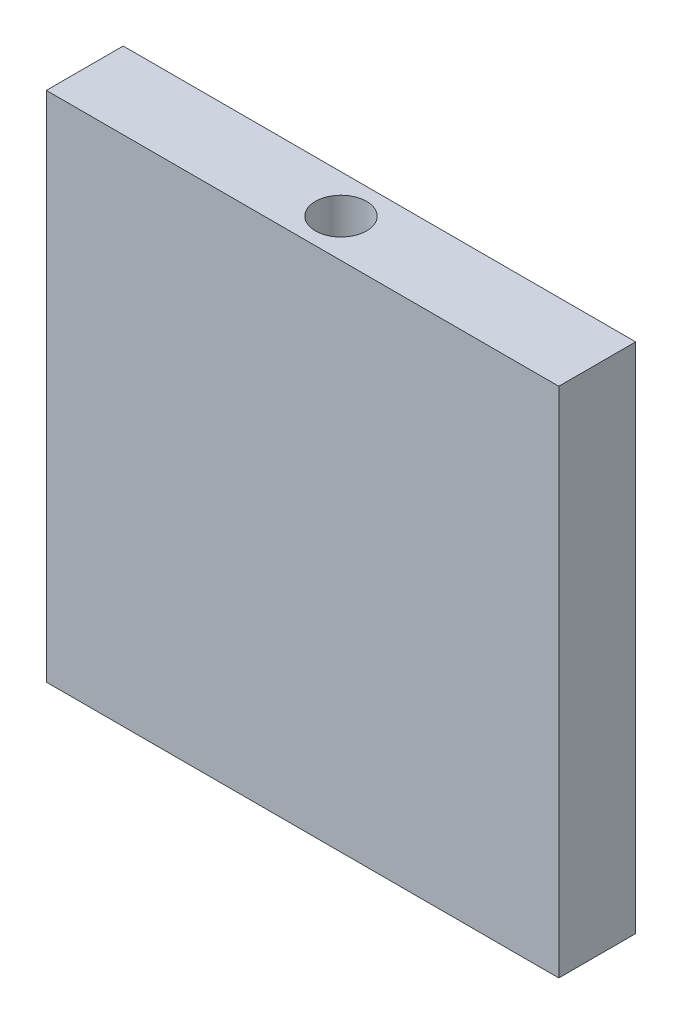
ISO-10303-21;
HEADER;
FILE_DESCRIPTION(('STEP AP214'),'2;1');
FILE_NAME('part.step','',(''),(''),'','','');
FILE_SCHEMA(('AUTOMOTIVE_DESIGN { 1 0 10303 214 1 1 1 1 }'));
ENDSEC;
DATA;
#1=APPLICATION_CONTEXT('core data for automotive mechanical design processes');
#2=APPLICATION_PROTOCOL_DEFINITION('international standard','automotive_design',2000,#1);
#3=PRODUCT_CONTEXT('',#1,'mechanical');
#4=PRODUCT('Part','Part','',(#3));
#5=PRODUCT_RELATED_PRODUCT_CATEGORY('part','',(#4));
#6=PRODUCT_DEFINITION_FORMATION('','',#4);
#7=PRODUCT_DEFINITION_CONTEXT('part definition',#1,'design');
#8=PRODUCT_DEFINITION('design','',#6,#7);
#9=PRODUCT_DEFINITION_SHAPE('','',#8);
#10=(LENGTH_UNIT() NAMED_UNIT(*) SI_UNIT(.MILLI.,.METRE.));
#11=(NAMED_UNIT(*) PLANE_ANGLE_UNIT() SI_UNIT($,.RADIAN.));
#12=(NAMED_UNIT(*) SI_UNIT($,.STERADIAN.) SOLID_ANGLE_UNIT());
#13=UNCERTAINTY_MEASURE_WITH_UNIT(LENGTH_MEASURE(1.E-05),#10,'distance_accuracy_value','');
#14=(GEOMETRIC_REPRESENTATION_CONTEXT(3) GLOBAL_UNCERTAINTY_ASSIGNED_CONTEXT((#13)) GLOBAL_UNIT_ASSIGNED_CONTEXT((#10,
#11,#12)) REPRESENTATION_CONTEXT('',''));
#15=CARTESIAN_POINT('',(0.,0.,0.));
#16=DIRECTION('',(0.,0.,1.));
#17=DIRECTION('',(1.,0.,0.));
#18=AXIS2_PLACEMENT_3D('',#15,#16,#17);
#19=CARTESIAN_POINT('',(0.,25.4,0.));
#20=DIRECTION('',(0.,1.,0.));
#21=DIRECTION('',(0.,0.,1.));
#22=AXIS2_PLACEMENT_3D('',#19,#20,#21);
#23=PLANE('',#22);
#24=DIRECTION('',(0.,0.,-1.));
#25=VECTOR('',#24,1.);
#26=CARTESIAN_POINT('',(12.7,25.4,-1.905));
#27=LINE('',#26,#25);
#28=CARTESIAN_POINT('',(12.7,25.4,1.905));
#29=VERTEX_POINT('',#28);
#30=CARTESIAN_POINT('',(12.7,25.4,-1.905));
#31=VERTEX_POINT('',#30);
#32=EDGE_CURVE('E88',#29,#31,#27,.T.);
#33=ORIENTED_EDGE('',*,*,#32,.T.);
#34=DIRECTION('',(-1.,0.,0.));
#35=VECTOR('',#34,1.);
#36=CARTESIAN_POINT('',(-12.7,25.4,-1.905));
#37=LINE('',#36,#35);
#38=CARTESIAN_POINT('',(-12.7,25.4,-1.905));
#39=VERTEX_POINT('',#38);
#40=EDGE_CURVE('E83',#31,#39,#37,.T.);
#41=ORIENTED_EDGE('',*,*,#40,.T.);
#42=DIRECTION('',(0.,0.,1.));
#43=VECTOR('',#42,1.);
#44=CARTESIAN_POINT('',(-12.7,25.4,-1.905));
#45=LINE('',#44,#43);
#46=CARTESIAN_POINT('',(-12.7,25.4,1.905));
#47=VERTEX_POINT('',#46);
#48=EDGE_CURVE('E86',#39,#47,#45,.T.);
#49=ORIENTED_EDGE('',*,*,#48,.T.);
#50=DIRECTION('',(1.,0.,0.));
#51=VECTOR('',#50,1.);
#52=CARTESIAN_POINT('',(-12.7,25.4,1.905));
#53=LINE('',#52,#51);
#54=EDGE_CURVE('E53',#47,#29,#53,.T.);
#55=ORIENTED_EDGE('',*,*,#54,.T.);
#56=EDGE_LOOP('',(#33,#41,#49,#55));
#57=FACE_BOUND('',#56,.T.);
#58=CARTESIAN_POINT('',(0.,25.4,0.));
#59=DIRECTION('',(0.,1.,0.));
#60=DIRECTION('',(0.,0.,1.));
#61=AXIS2_PLACEMENT_3D('',#58,#59,#60);
#62=CIRCLE('',#61,1.27);
#63=CARTESIAN_POINT('',(0.,25.4,1.27));
#64=VERTEX_POINT('',#63);
#65=EDGE_CURVE('E103',#64,#64,#62,.T.);
#66=ORIENTED_EDGE('',*,*,#65,.F.);
#67=EDGE_LOOP('',(#66));
#68=FACE_BOUND('',#67,.T.);
#69=ADVANCED_FACE('F36',(#57,#68),#23,.T.);
#70=CARTESIAN_POINT('',(0.,0.,0.));
#71=DIRECTION('',(0.,1.,0.));
#72=DIRECTION('',(0.,0.,1.));
#73=AXIS2_PLACEMENT_3D('',#70,#71,#72);
#74=PLANE('',#73);
#75=DIRECTION('',(0.,0.,-1.));
#76=VECTOR('',#75,1.);
#77=CARTESIAN_POINT('',(12.7,0.,-1.905));
#78=LINE('',#77,#76);
#79=CARTESIAN_POINT('',(12.7,0.,1.905));
#80=VERTEX_POINT('',#79);
#81=CARTESIAN_POINT('',(12.7,0.,-1.905));
#82=VERTEX_POINT('',#81);
#83=EDGE_CURVE('E100',#80,#82,#78,.T.);
#84=ORIENTED_EDGE('',*,*,#83,.F.);
#85=DIRECTION('',(1.,0.,0.));
#86=VECTOR('',#85,1.);
#87=CARTESIAN_POINT('',(-12.7,0.,1.905));
#88=LINE('',#87,#86);
#89=CARTESIAN_POINT('',(-12.7,0.,1.905));
#90=VERTEX_POINT('',#89);
#91=EDGE_CURVE('E76',#90,#80,#88,.T.);
#92=ORIENTED_EDGE('',*,*,#91,.F.);
#93=DIRECTION('',(0.,0.,1.));
#94=VECTOR('',#93,1.);
#95=CARTESIAN_POINT('',(-12.7,0.,-1.905));
#96=LINE('',#95,#94);
#97=CARTESIAN_POINT('',(-12.7,0.,-1.905));
#98=VERTEX_POINT('',#97);
#99=EDGE_CURVE('E70',#98,#90,#96,.T.);
#100=ORIENTED_EDGE('',*,*,#99,.F.);
#101=DIRECTION('',(-1.,0.,0.));
#102=VECTOR('',#101,1.);
#103=CARTESIAN_POINT('',(-12.7,0.,-1.905));
#104=LINE('',#103,#102);
#105=EDGE_CURVE('E92',#82,#98,#104,.T.);
#106=ORIENTED_EDGE('',*,*,#105,.F.);
#107=EDGE_LOOP('',(#84,#92,#100,#106));
#108=FACE_BOUND('',#107,.T.);
#109=CARTESIAN_POINT('',(0.,0.,0.));
#110=DIRECTION('',(0.,1.,0.));
#111=DIRECTION('',(0.,0.,1.));
#112=AXIS2_PLACEMENT_3D('',#109,#110,#111);
#113=CIRCLE('',#112,1.27);
#114=CARTESIAN_POINT('',(0.,0.,1.27));
#115=VERTEX_POINT('',#114);
#116=EDGE_CURVE('E115',#115,#115,#113,.T.);
#117=ORIENTED_EDGE('',*,*,#116,.T.);
#118=EDGE_LOOP('',(#117));
#119=FACE_BOUND('',#118,.T.);
#120=ADVANCED_FACE('F111',(#108,#119),#74,.F.);
#121=CARTESIAN_POINT('',(12.7,25.4,-1.905));
#122=DIRECTION('',(-1.,0.,0.));
#123=DIRECTION('',(0.,0.,1.));
#124=AXIS2_PLACEMENT_3D('',#121,#122,#123);
#125=PLANE('',#124);
#126=ORIENTED_EDGE('',*,*,#83,.T.);
#127=DIRECTION('',(0.,-1.,0.));
#128=VECTOR('',#127,1.);
#129=CARTESIAN_POINT('',(12.7,25.4,-1.905));
#130=LINE('',#129,#128);
#131=EDGE_CURVE('E11',#31,#82,#130,.T.);
#132=ORIENTED_EDGE('',*,*,#131,.F.);
#133=ORIENTED_EDGE('',*,*,#32,.F.);
#134=DIRECTION('',(0.,-1.,0.));
#135=VECTOR('',#134,1.);
#136=CARTESIAN_POINT('',(12.7,25.4,1.905));
#137=LINE('',#136,#135);
#138=EDGE_CURVE('E96',#29,#80,#137,.T.);
#139=ORIENTED_EDGE('',*,*,#138,.T.);
#140=EDGE_LOOP('',(#126,#132,#133,#139));
#141=FACE_BOUND('',#140,.T.);
#142=ADVANCED_FACE('F38',(#141),#125,.F.);
#143=CARTESIAN_POINT('',(-12.7,25.4,-1.905));
#144=DIRECTION('',(0.,0.,1.));
#145=DIRECTION('',(1.,0.,0.));
#146=AXIS2_PLACEMENT_3D('',#143,#144,#145);
#147=PLANE('',#146);
#148=ORIENTED_EDGE('',*,*,#105,.T.);
#149=DIRECTION('',(0.,-1.,0.));
#150=VECTOR('',#149,1.);
#151=CARTESIAN_POINT('',(-12.7,25.4,-1.905));
#152=LINE('',#151,#150);
#153=EDGE_CURVE('E45',#39,#98,#152,.T.);
#154=ORIENTED_EDGE('',*,*,#153,.F.);
#155=ORIENTED_EDGE('',*,*,#40,.F.);
#156=ORIENTED_EDGE('',*,*,#131,.T.);
#157=EDGE_LOOP('',(#148,#154,#155,#156));
#158=FACE_BOUND('',#157,.T.);
#159=ADVANCED_FACE('F91',(#158),#147,.F.);
#160=CARTESIAN_POINT('',(-12.7,25.4,-1.905));
#161=DIRECTION('',(1.,0.,0.));
#162=DIRECTION('',(0.,0.,-1.));
#163=AXIS2_PLACEMENT_3D('',#160,#161,#162);
#164=PLANE('',#163);
#165=ORIENTED_EDGE('',*,*,#99,.T.);
#166=DIRECTION('',(0.,-1.,0.));
#167=VECTOR('',#166,1.);
#168=CARTESIAN_POINT('',(-12.7,25.4,1.905));
#169=LINE('',#168,#167);
#170=EDGE_CURVE('E93',#47,#90,#169,.T.);
#171=ORIENTED_EDGE('',*,*,#170,.F.);
#172=ORIENTED_EDGE('',*,*,#48,.F.);
#173=ORIENTED_EDGE('',*,*,#153,.T.);
#174=EDGE_LOOP('',(#165,#171,#172,#173));
#175=FACE_BOUND('',#174,.T.);
#176=ADVANCED_FACE('F94',(#175),#164,.F.);
#177=CARTESIAN_POINT('',(-12.7,25.4,1.905));
#178=DIRECTION('',(0.,0.,-1.));
#179=DIRECTION('',(-1.,0.,0.));
#180=AXIS2_PLACEMENT_3D('',#177,#178,#179);
#181=PLANE('',#180);
#182=ORIENTED_EDGE('',*,*,#91,.T.);
#183=ORIENTED_EDGE('',*,*,#138,.F.);
#184=ORIENTED_EDGE('',*,*,#54,.F.);
#185=ORIENTED_EDGE('',*,*,#170,.T.);
#186=EDGE_LOOP('',(#182,#183,#184,#185));
#187=FACE_BOUND('',#186,.T.);
#188=ADVANCED_FACE('F108',(#187),#181,.F.);
#189=CARTESIAN_POINT('',(0.,25.4,0.));
#190=DIRECTION('',(0.,-1.,0.));
#191=DIRECTION('',(0.,0.,-1.));
#192=AXIS2_PLACEMENT_3D('',#189,#190,#191);
#193=CYLINDRICAL_SURFACE('',#192,1.27);
#194=ORIENTED_EDGE('',*,*,#65,.T.);
#195=EDGE_LOOP('',(#194));
#196=FACE_BOUND('',#195,.T.);
#197=ORIENTED_EDGE('',*,*,#116,.F.);
#198=EDGE_LOOP('',(#197));
#199=FACE_BOUND('',#198,.T.);
#200=ADVANCED_FACE('F121',(#196,#199),#193,.F.);
#201=CLOSED_SHELL('',(#69,#120,#142,#159,#176,#188,#200));
#202=MANIFOLD_SOLID_BREP('B2',#201);
#203=ADVANCED_BREP_SHAPE_REPRESENTATION('',(#18,#202),#14);
#204=SHAPE_DEFINITION_REPRESENTATION(#9,#203);
ENDSEC;
END-ISO-10303-21;
